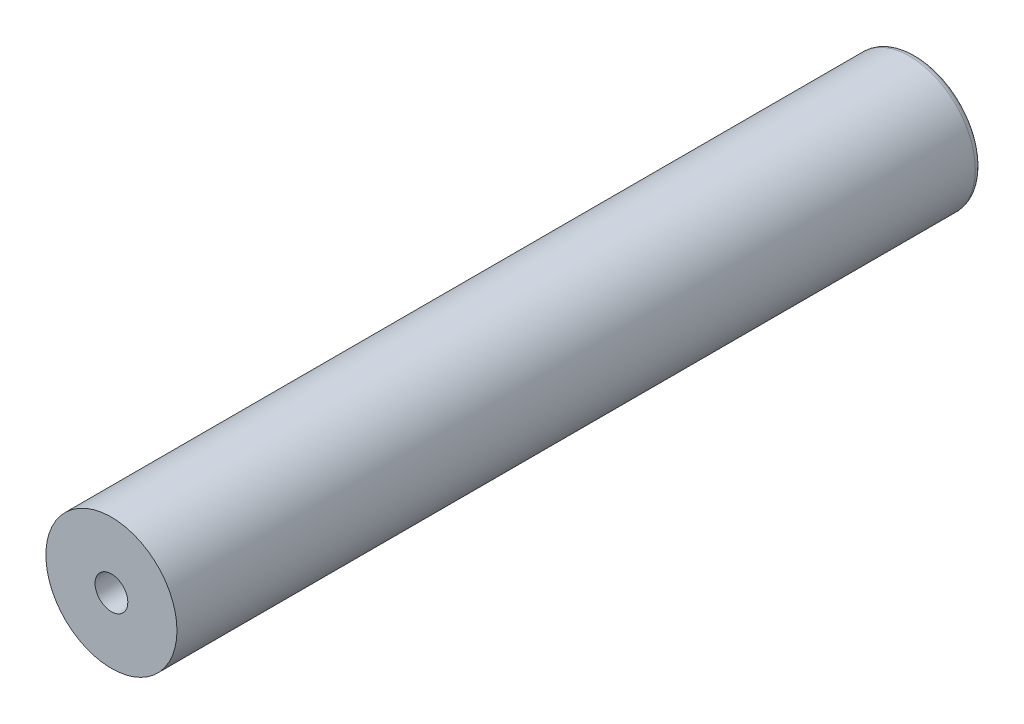
ISO-10303-21;
HEADER;
FILE_DESCRIPTION(('STEP AP214'),'2;1');
FILE_NAME('part.step','',(''),(''),'','','');
FILE_SCHEMA(('AUTOMOTIVE_DESIGN { 1 0 10303 214 1 1 1 1 }'));
ENDSEC;
DATA;
#1=APPLICATION_CONTEXT('core data for automotive mechanical design processes');
#2=APPLICATION_PROTOCOL_DEFINITION('international standard','automotive_design',2000,#1);
#3=PRODUCT_CONTEXT('',#1,'mechanical');
#4=PRODUCT('Part','Part','',(#3));
#5=PRODUCT_RELATED_PRODUCT_CATEGORY('part','',(#4));
#6=PRODUCT_DEFINITION_FORMATION('','',#4);
#7=PRODUCT_DEFINITION_CONTEXT('part definition',#1,'design');
#8=PRODUCT_DEFINITION('design','',#6,#7);
#9=PRODUCT_DEFINITION_SHAPE('','',#8);
#10=(LENGTH_UNIT() NAMED_UNIT(*) SI_UNIT(.MILLI.,.METRE.));
#11=(NAMED_UNIT(*) PLANE_ANGLE_UNIT() SI_UNIT($,.RADIAN.));
#12=(NAMED_UNIT(*) SI_UNIT($,.STERADIAN.) SOLID_ANGLE_UNIT());
#13=UNCERTAINTY_MEASURE_WITH_UNIT(LENGTH_MEASURE(1.E-05),#10,'distance_accuracy_value','');
#14=(GEOMETRIC_REPRESENTATION_CONTEXT(3) GLOBAL_UNCERTAINTY_ASSIGNED_CONTEXT((#13)) GLOBAL_UNIT_ASSIGNED_CONTEXT((#10,
#11,#12)) REPRESENTATION_CONTEXT('',''));
#15=CARTESIAN_POINT('',(0.,0.,0.));
#16=DIRECTION('',(0.,0.,1.));
#17=DIRECTION('',(1.,0.,0.));
#18=AXIS2_PLACEMENT_3D('',#15,#16,#17);
#19=CARTESIAN_POINT('',(240.708388301789,2.59608285867283,61.4));
#20=DIRECTION('',(0.,0.,-1.));
#21=DIRECTION('',(-1.,0.,0.));
#22=AXIS2_PLACEMENT_3D('',#19,#20,#21);
#23=CYLINDRICAL_SURFACE('',#22,5.00000000000002);
#24=CARTESIAN_POINT('',(240.708388301789,2.59608285867283,0.5));
#25=DIRECTION('',(0.,0.,1.));
#26=DIRECTION('',(1.,0.,0.));
#27=AXIS2_PLACEMENT_3D('',#24,#25,#26);
#28=CIRCLE('',#27,5.00000000000002);
#29=CARTESIAN_POINT('',(245.708388301789,2.59608285867283,0.5));
#30=VERTEX_POINT('',#29);
#31=EDGE_CURVE('E41',#30,#30,#28,.T.);
#32=ORIENTED_EDGE('',*,*,#31,.T.);
#33=EDGE_LOOP('',(#32));
#34=FACE_BOUND('',#33,.T.);
#35=CARTESIAN_POINT('',(240.708388301789,2.59608285867283,61.4));
#36=DIRECTION('',(0.,0.,1.));
#37=DIRECTION('',(1.,0.,0.));
#38=AXIS2_PLACEMENT_3D('',#35,#36,#37);
#39=CIRCLE('',#38,5.00000000000002);
#40=CARTESIAN_POINT('',(245.708388301789,2.59608285867283,61.4));
#41=VERTEX_POINT('',#40);
#42=EDGE_CURVE('E67',#41,#41,#39,.T.);
#43=ORIENTED_EDGE('',*,*,#42,.F.);
#44=EDGE_LOOP('',(#43));
#45=FACE_BOUND('',#44,.T.);
#46=ADVANCED_FACE('F33',(#34,#45),#23,.T.);
#47=CARTESIAN_POINT('',(240.708388301789,2.59608285867283,61.4));
#48=DIRECTION('',(0.,0.,1.));
#49=DIRECTION('',(1.,0.,0.));
#50=AXIS2_PLACEMENT_3D('',#47,#48,#49);
#51=PLANE('',#50);
#52=CARTESIAN_POINT('',(240.708388301789,2.59608285867283,61.4));
#53=DIRECTION('',(0.,0.,1.));
#54=DIRECTION('',(1.,0.,0.));
#55=AXIS2_PLACEMENT_3D('',#52,#53,#54);
#56=CIRCLE('',#55,1.25);
#57=CARTESIAN_POINT('',(241.958388301789,2.59608285867283,61.4));
#58=VERTEX_POINT('',#57);
#59=EDGE_CURVE('E57',#58,#58,#56,.T.);
#60=ORIENTED_EDGE('',*,*,#59,.F.);
#61=EDGE_LOOP('',(#60));
#62=FACE_BOUND('',#61,.T.);
#63=ORIENTED_EDGE('',*,*,#42,.T.);
#64=EDGE_LOOP('',(#63));
#65=FACE_BOUND('',#64,.T.);
#66=ADVANCED_FACE('F85',(#62,#65),#51,.T.);
#67=CARTESIAN_POINT('',(240.708388301789,2.59608285867283,0.));
#68=DIRECTION('',(0.,0.,1.));
#69=DIRECTION('',(1.,0.,0.));
#70=AXIS2_PLACEMENT_3D('',#67,#68,#69);
#71=PLANE('',#70);
#72=CARTESIAN_POINT('',(240.708388301789,2.59608285867283,0.));
#73=DIRECTION('',(0.,0.,1.));
#74=DIRECTION('',(1.,0.,0.));
#75=AXIS2_PLACEMENT_3D('',#72,#73,#74);
#76=CIRCLE('',#75,4.50000000000002);
#77=CARTESIAN_POINT('',(245.208388301789,2.59608285867283,0.));
#78=VERTEX_POINT('',#77);
#79=EDGE_CURVE('E11',#78,#78,#76,.F.);
#80=ORIENTED_EDGE('',*,*,#79,.T.);
#81=EDGE_LOOP('',(#80));
#82=FACE_BOUND('',#81,.T.);
#83=CARTESIAN_POINT('',(240.708388301787,2.59608285867252,0.));
#84=DIRECTION('',(0.,0.,-1.));
#85=DIRECTION('',(-1.,0.,0.));
#86=AXIS2_PLACEMENT_3D('',#83,#84,#85);
#87=CIRCLE('',#86,1.25);
#88=CARTESIAN_POINT('',(239.458388301787,2.59608285867252,0.));
#89=VERTEX_POINT('',#88);
#90=EDGE_CURVE('E56',#89,#89,#87,.T.);
#91=ORIENTED_EDGE('',*,*,#90,.F.);
#92=EDGE_LOOP('',(#91));
#93=FACE_BOUND('',#92,.T.);
#94=ADVANCED_FACE('F89',(#82,#93),#71,.F.);
#95=CARTESIAN_POINT('',(240.708388301787,2.59608285867252,8.49999999999999));
#96=DIRECTION('',(0.,0.,-1.));
#97=DIRECTION('',(-1.,0.,0.));
#98=AXIS2_PLACEMENT_3D('',#95,#96,#97);
#99=CONICAL_SURFACE('',#98,1.25,1.02974425867666);
#100=CARTESIAN_POINT('',(240.708388301787,2.59608285867252,9.25107577378444));
#101=VERTEX_POINT('',#100);
#102=VERTEX_LOOP('',#101);
#103=FACE_BOUND('',#102,.T.);
#104=CARTESIAN_POINT('',(240.708388301787,2.59608285867252,8.49999999999999));
#105=DIRECTION('',(0.,0.,-1.));
#106=DIRECTION('',(-1.,0.,0.));
#107=AXIS2_PLACEMENT_3D('',#104,#105,#106);
#108=CIRCLE('',#107,1.25);
#109=CARTESIAN_POINT('',(239.458388301787,2.59608285867252,8.49999999999999));
#110=VERTEX_POINT('',#109);
#111=EDGE_CURVE('E60',#110,#110,#108,.T.);
#112=ORIENTED_EDGE('',*,*,#111,.T.);
#113=EDGE_LOOP('',(#112));
#114=FACE_BOUND('',#113,.T.);
#115=ADVANCED_FACE('F80',(#103,#114),#99,.F.);
#116=CARTESIAN_POINT('',(240.708388301787,2.59608285867252,0.));
#117=DIRECTION('',(0.,0.,-1.));
#118=DIRECTION('',(-1.,0.,0.));
#119=AXIS2_PLACEMENT_3D('',#116,#117,#118);
#120=CYLINDRICAL_SURFACE('',#119,1.25);
#121=ORIENTED_EDGE('',*,*,#111,.F.);
#122=EDGE_LOOP('',(#121));
#123=FACE_BOUND('',#122,.T.);
#124=ORIENTED_EDGE('',*,*,#90,.T.);
#125=EDGE_LOOP('',(#124));
#126=FACE_BOUND('',#125,.T.);
#127=ADVANCED_FACE('F75',(#123,#126),#120,.F.);
#128=CARTESIAN_POINT('',(240.708388301789,2.59608285867283,0.5));
#129=DIRECTION('',(0.,0.,1.));
#130=DIRECTION('',(1.,0.,0.));
#131=AXIS2_PLACEMENT_3D('',#128,#129,#130);
#132=TOROIDAL_SURFACE('',#131,4.50000000000002,0.5);
#133=ORIENTED_EDGE('',*,*,#79,.F.);
#134=EDGE_LOOP('',(#133));
#135=FACE_BOUND('',#134,.T.);
#136=ORIENTED_EDGE('',*,*,#31,.F.);
#137=EDGE_LOOP('',(#136));
#138=FACE_BOUND('',#137,.T.);
#139=ADVANCED_FACE('F35',(#135,#138),#132,.T.);
#140=CARTESIAN_POINT('',(240.708388301789,2.59608285867283,56.4));
#141=DIRECTION('',(0.,0.,1.));
#142=DIRECTION('',(1.,0.,0.));
#143=AXIS2_PLACEMENT_3D('',#140,#141,#142);
#144=CONICAL_SURFACE('',#143,1.25,1.02974425867666);
#145=CARTESIAN_POINT('',(240.708388301789,2.59608285867283,55.6489242262155));
#146=VERTEX_POINT('',#145);
#147=VERTEX_LOOP('',#146);
#148=FACE_BOUND('',#147,.T.);
#149=CARTESIAN_POINT('',(240.708388301789,2.59608285867283,56.4));
#150=DIRECTION('',(0.,0.,1.));
#151=DIRECTION('',(1.,0.,0.));
#152=AXIS2_PLACEMENT_3D('',#149,#150,#151);
#153=CIRCLE('',#152,1.25);
#154=CARTESIAN_POINT('',(241.958388301789,2.59608285867283,56.4));
#155=VERTEX_POINT('',#154);
#156=EDGE_CURVE('E54',#155,#155,#153,.T.);
#157=ORIENTED_EDGE('',*,*,#156,.T.);
#158=EDGE_LOOP('',(#157));
#159=FACE_BOUND('',#158,.T.);
#160=ADVANCED_FACE('F47',(#148,#159),#144,.F.);
#161=CARTESIAN_POINT('',(240.708388301789,2.59608285867283,61.4));
#162=DIRECTION('',(0.,0.,1.));
#163=DIRECTION('',(1.,0.,0.));
#164=AXIS2_PLACEMENT_3D('',#161,#162,#163);
#165=CYLINDRICAL_SURFACE('',#164,1.25);
#166=ORIENTED_EDGE('',*,*,#156,.F.);
#167=EDGE_LOOP('',(#166));
#168=FACE_BOUND('',#167,.T.);
#169=ORIENTED_EDGE('',*,*,#59,.T.);
#170=EDGE_LOOP('',(#169));
#171=FACE_BOUND('',#170,.T.);
#172=ADVANCED_FACE('F50',(#168,#171),#165,.F.);
#173=CLOSED_SHELL('',(#46,#66,#94,#115,#127,#139,#160,#172));
#174=MANIFOLD_SOLID_BREP('B2',#173);
#175=ADVANCED_BREP_SHAPE_REPRESENTATION('',(#18,#174),#14);
#176=SHAPE_DEFINITION_REPRESENTATION(#9,#175);
ENDSEC;
END-ISO-10303-21;
